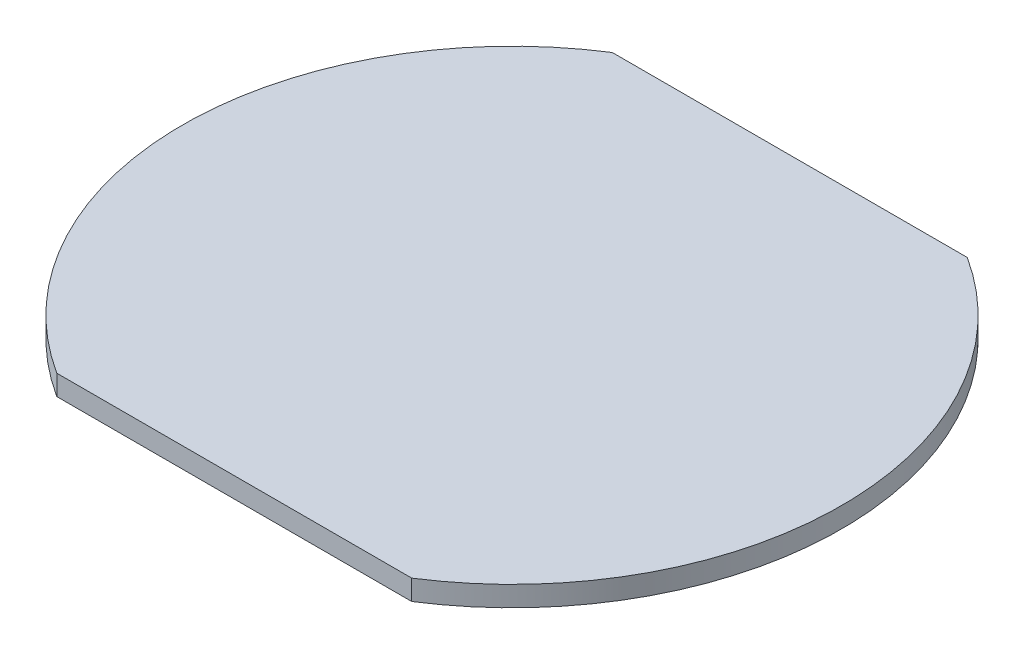
ISO-10303-21;
HEADER;
FILE_DESCRIPTION(('STEP AP214'),'2;1');
FILE_NAME('part.step','',(''),(''),'','','');
FILE_SCHEMA(('AUTOMOTIVE_DESIGN { 1 0 10303 214 1 1 1 1 }'));
ENDSEC;
DATA;
#1=APPLICATION_CONTEXT('core data for automotive mechanical design processes');
#2=APPLICATION_PROTOCOL_DEFINITION('international standard','automotive_design',2000,#1);
#3=PRODUCT_CONTEXT('',#1,'mechanical');
#4=PRODUCT('Part','Part','',(#3));
#5=PRODUCT_RELATED_PRODUCT_CATEGORY('part','',(#4));
#6=PRODUCT_DEFINITION_FORMATION('','',#4);
#7=PRODUCT_DEFINITION_CONTEXT('part definition',#1,'design');
#8=PRODUCT_DEFINITION('design','',#6,#7);
#9=PRODUCT_DEFINITION_SHAPE('','',#8);
#10=(LENGTH_UNIT() NAMED_UNIT(*) SI_UNIT(.MILLI.,.METRE.));
#11=(NAMED_UNIT(*) PLANE_ANGLE_UNIT() SI_UNIT($,.RADIAN.));
#12=(NAMED_UNIT(*) SI_UNIT($,.STERADIAN.) SOLID_ANGLE_UNIT());
#13=UNCERTAINTY_MEASURE_WITH_UNIT(LENGTH_MEASURE(1.E-05),#10,'distance_accuracy_value','');
#14=(GEOMETRIC_REPRESENTATION_CONTEXT(3) GLOBAL_UNCERTAINTY_ASSIGNED_CONTEXT((#13)) GLOBAL_UNIT_ASSIGNED_CONTEXT((#10,
#11,#12)) REPRESENTATION_CONTEXT('',''));
#15=CARTESIAN_POINT('',(0.,0.,0.));
#16=DIRECTION('',(0.,0.,1.));
#17=DIRECTION('',(1.,0.,0.));
#18=AXIS2_PLACEMENT_3D('',#15,#16,#17);
#19=CARTESIAN_POINT('',(0.,2.,0.));
#20=DIRECTION('',(0.,-1.,0.));
#21=DIRECTION('',(0.,0.,-1.));
#22=AXIS2_PLACEMENT_3D('',#19,#20,#21);
#23=CYLINDRICAL_SURFACE('',#22,32.5);
#24=CARTESIAN_POINT('',(0.,2.,0.));
#25=DIRECTION('',(0.,1.,0.));
#26=DIRECTION('',(0.,0.,1.));
#27=AXIS2_PLACEMENT_3D('',#24,#25,#26);
#28=CIRCLE('',#27,32.5);
#29=CARTESIAN_POINT('',(17.5,2.,27.3861278752583));
#30=VERTEX_POINT('',#29);
#31=CARTESIAN_POINT('',(17.5,2.,-27.3861278752583));
#32=VERTEX_POINT('',#31);
#33=EDGE_CURVE('E41',#30,#32,#28,.T.);
#34=ORIENTED_EDGE('',*,*,#33,.F.);
#35=DIRECTION('',(0.,1.,0.));
#36=VECTOR('',#35,1.);
#37=CARTESIAN_POINT('',(17.5,-35.3716226388925,27.3861278752583));
#38=LINE('',#37,#36);
#39=CARTESIAN_POINT('',(17.5,0.,27.3861278752583));
#40=VERTEX_POINT('',#39);
#41=EDGE_CURVE('E73',#40,#30,#38,.T.);
#42=ORIENTED_EDGE('',*,*,#41,.F.);
#43=CARTESIAN_POINT('',(0.,0.,0.));
#44=DIRECTION('',(0.,1.,0.));
#45=DIRECTION('',(0.,0.,1.));
#46=AXIS2_PLACEMENT_3D('',#43,#44,#45);
#47=CIRCLE('',#46,32.5);
#48=CARTESIAN_POINT('',(17.5,0.,-27.3861278752583));
#49=VERTEX_POINT('',#48);
#50=EDGE_CURVE('E56',#40,#49,#47,.T.);
#51=ORIENTED_EDGE('',*,*,#50,.T.);
#52=DIRECTION('',(0.,1.,0.));
#53=VECTOR('',#52,1.);
#54=CARTESIAN_POINT('',(17.5,-35.3716226388925,-27.3861278752583));
#55=LINE('',#54,#53);
#56=EDGE_CURVE('E86',#49,#32,#55,.T.);
#57=ORIENTED_EDGE('',*,*,#56,.T.);
#58=EDGE_LOOP('',(#34,#42,#51,#57));
#59=FACE_BOUND('',#58,.T.);
#60=ADVANCED_FACE('F32',(#59),#23,.T.);
#61=CARTESIAN_POINT('',(-17.5,0.,-27.3861278752583));
#62=VERTEX_POINT('',#61);
#63=CARTESIAN_POINT('',(-17.5,0.,27.3861278752583));
#64=VERTEX_POINT('',#63);
#65=EDGE_CURVE('E36',#62,#64,#47,.T.);
#66=ORIENTED_EDGE('',*,*,#65,.T.);
#67=DIRECTION('',(0.,1.,0.));
#68=VECTOR('',#67,1.);
#69=CARTESIAN_POINT('',(-17.5,-35.3716226388925,27.3861278752583));
#70=LINE('',#69,#68);
#71=CARTESIAN_POINT('',(-17.5,2.,27.3861278752583));
#72=VERTEX_POINT('',#71);
#73=EDGE_CURVE('E48',#64,#72,#70,.T.);
#74=ORIENTED_EDGE('',*,*,#73,.T.);
#75=CARTESIAN_POINT('',(-17.5,2.,-27.3861278752583));
#76=VERTEX_POINT('',#75);
#77=EDGE_CURVE('E11',#76,#72,#28,.T.);
#78=ORIENTED_EDGE('',*,*,#77,.F.);
#79=DIRECTION('',(0.,1.,0.));
#80=VECTOR('',#79,1.);
#81=CARTESIAN_POINT('',(-17.5,-35.3716226388925,-27.3861278752583));
#82=LINE('',#81,#80);
#83=EDGE_CURVE('E91',#62,#76,#82,.T.);
#84=ORIENTED_EDGE('',*,*,#83,.F.);
#85=EDGE_LOOP('',(#66,#74,#78,#84));
#86=FACE_BOUND('',#85,.T.);
#87=ADVANCED_FACE('F34',(#86),#23,.T.);
#88=CARTESIAN_POINT('',(0.,2.,0.));
#89=DIRECTION('',(0.,1.,0.));
#90=DIRECTION('',(0.,0.,1.));
#91=AXIS2_PLACEMENT_3D('',#88,#89,#90);
#92=PLANE('',#91);
#93=DIRECTION('',(-1.,0.,0.));
#94=VECTOR('',#93,1.);
#95=CARTESIAN_POINT('',(17.5,2.,27.3861278752583));
#96=LINE('',#95,#94);
#97=EDGE_CURVE('E76',#30,#72,#96,.T.);
#98=ORIENTED_EDGE('',*,*,#97,.F.);
#99=ORIENTED_EDGE('',*,*,#33,.T.);
#100=DIRECTION('',(1.,0.,0.));
#101=VECTOR('',#100,1.);
#102=CARTESIAN_POINT('',(17.5,2.,-27.3861278752583));
#103=LINE('',#102,#101);
#104=EDGE_CURVE('E93',#76,#32,#103,.T.);
#105=ORIENTED_EDGE('',*,*,#104,.F.);
#106=ORIENTED_EDGE('',*,*,#77,.T.);
#107=EDGE_LOOP('',(#98,#99,#105,#106));
#108=FACE_BOUND('',#107,.T.);
#109=ADVANCED_FACE('F81',(#108),#92,.T.);
#110=CARTESIAN_POINT('',(0.,0.,0.));
#111=DIRECTION('',(0.,1.,0.));
#112=DIRECTION('',(0.,0.,1.));
#113=AXIS2_PLACEMENT_3D('',#110,#111,#112);
#114=PLANE('',#113);
#115=ORIENTED_EDGE('',*,*,#50,.F.);
#116=DIRECTION('',(1.,0.,0.));
#117=VECTOR('',#116,1.);
#118=CARTESIAN_POINT('',(17.5,0.,27.3861278752583));
#119=LINE('',#118,#117);
#120=EDGE_CURVE('E77',#64,#40,#119,.T.);
#121=ORIENTED_EDGE('',*,*,#120,.F.);
#122=ORIENTED_EDGE('',*,*,#65,.F.);
#123=DIRECTION('',(-1.,0.,0.));
#124=VECTOR('',#123,1.);
#125=CARTESIAN_POINT('',(17.5,0.,-27.3861278752583));
#126=LINE('',#125,#124);
#127=EDGE_CURVE('E89',#49,#62,#126,.T.);
#128=ORIENTED_EDGE('',*,*,#127,.F.);
#129=EDGE_LOOP('',(#115,#121,#122,#128));
#130=FACE_BOUND('',#129,.T.);
#131=ADVANCED_FACE('F102',(#130),#114,.F.);
#132=CARTESIAN_POINT('',(17.5,-35.3716226388925,-27.3861278752583));
#133=DIRECTION('',(0.,0.,1.));
#134=DIRECTION('',(1.,0.,0.));
#135=AXIS2_PLACEMENT_3D('',#132,#133,#134);
#136=PLANE('',#135);
#137=ORIENTED_EDGE('',*,*,#127,.T.);
#138=ORIENTED_EDGE('',*,*,#83,.T.);
#139=ORIENTED_EDGE('',*,*,#104,.T.);
#140=ORIENTED_EDGE('',*,*,#56,.F.);
#141=EDGE_LOOP('',(#137,#138,#139,#140));
#142=FACE_BOUND('',#141,.T.);
#143=ADVANCED_FACE('F104',(#142),#136,.F.);
#144=CARTESIAN_POINT('',(17.5,-35.3716226388925,27.3861278752583));
#145=DIRECTION('',(0.,0.,-1.));
#146=DIRECTION('',(-1.,0.,0.));
#147=AXIS2_PLACEMENT_3D('',#144,#145,#146);
#148=PLANE('',#147);
#149=ORIENTED_EDGE('',*,*,#120,.T.);
#150=ORIENTED_EDGE('',*,*,#41,.T.);
#151=ORIENTED_EDGE('',*,*,#97,.T.);
#152=ORIENTED_EDGE('',*,*,#73,.F.);
#153=EDGE_LOOP('',(#149,#150,#151,#152));
#154=FACE_BOUND('',#153,.T.);
#155=ADVANCED_FACE('F75',(#154),#148,.F.);
#156=CLOSED_SHELL('',(#60,#87,#109,#131,#143,#155));
#157=MANIFOLD_SOLID_BREP('B2',#156);
#158=ADVANCED_BREP_SHAPE_REPRESENTATION('',(#18,#157),#14);
#159=SHAPE_DEFINITION_REPRESENTATION(#9,#158);
ENDSEC;
END-ISO-10303-21;
